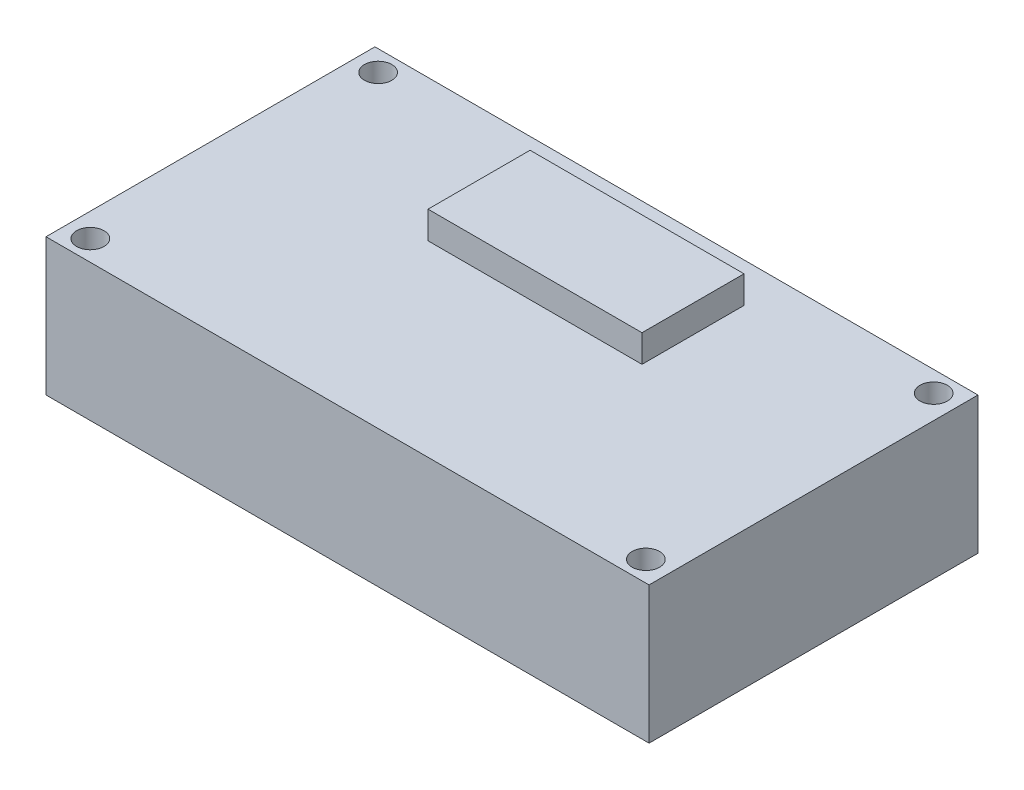
ISO-10303-21;
HEADER;
FILE_DESCRIPTION(('STEP AP214'),'2;1');
FILE_NAME('part.step','',(''),(''),'','','');
FILE_SCHEMA(('AUTOMOTIVE_DESIGN { 1 0 10303 214 1 1 1 1 }'));
ENDSEC;
DATA;
#1=APPLICATION_CONTEXT('core data for automotive mechanical design processes');
#2=APPLICATION_PROTOCOL_DEFINITION('international standard','automotive_design',2000,#1);
#3=PRODUCT_CONTEXT('',#1,'mechanical');
#4=PRODUCT('Part','Part','',(#3));
#5=PRODUCT_RELATED_PRODUCT_CATEGORY('part','',(#4));
#6=PRODUCT_DEFINITION_FORMATION('','',#4);
#7=PRODUCT_DEFINITION_CONTEXT('part definition',#1,'design');
#8=PRODUCT_DEFINITION('design','',#6,#7);
#9=PRODUCT_DEFINITION_SHAPE('','',#8);
#10=(LENGTH_UNIT() NAMED_UNIT(*) SI_UNIT(.MILLI.,.METRE.));
#11=(NAMED_UNIT(*) PLANE_ANGLE_UNIT() SI_UNIT($,.RADIAN.));
#12=(NAMED_UNIT(*) SI_UNIT($,.STERADIAN.) SOLID_ANGLE_UNIT());
#13=UNCERTAINTY_MEASURE_WITH_UNIT(LENGTH_MEASURE(1.E-05),#10,'distance_accuracy_value','');
#14=(GEOMETRIC_REPRESENTATION_CONTEXT(3) GLOBAL_UNCERTAINTY_ASSIGNED_CONTEXT((#13)) GLOBAL_UNIT_ASSIGNED_CONTEXT((#10,
#11,#12)) REPRESENTATION_CONTEXT('',''));
#15=CARTESIAN_POINT('',(0.,0.,0.));
#16=DIRECTION('',(0.,0.,1.));
#17=DIRECTION('',(1.,0.,0.));
#18=AXIS2_PLACEMENT_3D('',#15,#16,#17);
#19=CARTESIAN_POINT('',(0.,15.,0.));
#20=DIRECTION('',(0.,-1.,0.));
#21=DIRECTION('',(0.,0.,-1.));
#22=AXIS2_PLACEMENT_3D('',#19,#20,#21);
#23=PLANE('',#22);
#24=DIRECTION('',(0.,0.,-1.));
#25=VECTOR('',#24,1.);
#26=CARTESIAN_POINT('',(33.,15.,18.));
#27=LINE('',#26,#25);
#28=CARTESIAN_POINT('',(33.,15.,18.));
#29=VERTEX_POINT('',#28);
#30=CARTESIAN_POINT('',(33.,15.,-18.));
#31=VERTEX_POINT('',#30);
#32=EDGE_CURVE('E174',#29,#31,#27,.T.);
#33=ORIENTED_EDGE('',*,*,#32,.T.);
#34=DIRECTION('',(-1.,0.,0.));
#35=VECTOR('',#34,1.);
#36=CARTESIAN_POINT('',(-33.,15.,-18.));
#37=LINE('',#36,#35);
#38=CARTESIAN_POINT('',(-33.,15.,-18.));
#39=VERTEX_POINT('',#38);
#40=EDGE_CURVE('E178',#31,#39,#37,.T.);
#41=ORIENTED_EDGE('',*,*,#40,.T.);
#42=DIRECTION('',(0.,0.,1.));
#43=VECTOR('',#42,1.);
#44=CARTESIAN_POINT('',(-33.,15.,18.));
#45=LINE('',#44,#43);
#46=CARTESIAN_POINT('',(-33.,15.,18.));
#47=VERTEX_POINT('',#46);
#48=EDGE_CURVE('E182',#39,#47,#45,.T.);
#49=ORIENTED_EDGE('',*,*,#48,.T.);
#50=DIRECTION('',(1.,0.,0.));
#51=VECTOR('',#50,1.);
#52=CARTESIAN_POINT('',(-33.,15.,18.));
#53=LINE('',#52,#51);
#54=EDGE_CURVE('E185',#47,#29,#53,.T.);
#55=ORIENTED_EDGE('',*,*,#54,.T.);
#56=EDGE_LOOP('',(#33,#41,#49,#55));
#57=FACE_BOUND('',#56,.T.);
#58=CARTESIAN_POINT('',(-30.4,15.,-15.75));
#59=DIRECTION('',(0.,1.,0.));
#60=DIRECTION('',(0.,0.,1.));
#61=AXIS2_PLACEMENT_3D('',#58,#59,#60);
#62=CIRCLE('',#61,1.5);
#63=CARTESIAN_POINT('',(-30.4,15.,-14.25));
#64=VERTEX_POINT('',#63);
#65=EDGE_CURVE('E150',#64,#64,#62,.T.);
#66=ORIENTED_EDGE('',*,*,#65,.F.);
#67=EDGE_LOOP('',(#66));
#68=FACE_BOUND('',#67,.T.);
#69=CARTESIAN_POINT('',(-30.4,15.,15.75));
#70=DIRECTION('',(0.,1.,0.));
#71=DIRECTION('',(0.,0.,1.));
#72=AXIS2_PLACEMENT_3D('',#69,#70,#71);
#73=CIRCLE('',#72,1.5);
#74=CARTESIAN_POINT('',(-30.4,15.,17.25));
#75=VERTEX_POINT('',#74);
#76=EDGE_CURVE('E146',#75,#75,#73,.T.);
#77=ORIENTED_EDGE('',*,*,#76,.F.);
#78=EDGE_LOOP('',(#77));
#79=FACE_BOUND('',#78,.T.);
#80=CARTESIAN_POINT('',(30.4,15.,15.75));
#81=DIRECTION('',(0.,1.,0.));
#82=DIRECTION('',(0.,0.,1.));
#83=AXIS2_PLACEMENT_3D('',#80,#81,#82);
#84=CIRCLE('',#83,1.5);
#85=CARTESIAN_POINT('',(30.4,15.,17.25));
#86=VERTEX_POINT('',#85);
#87=EDGE_CURVE('E155',#86,#86,#84,.T.);
#88=ORIENTED_EDGE('',*,*,#87,.F.);
#89=EDGE_LOOP('',(#88));
#90=FACE_BOUND('',#89,.T.);
#91=CARTESIAN_POINT('',(30.4,15.,-15.75));
#92=DIRECTION('',(0.,1.,0.));
#93=DIRECTION('',(0.,0.,1.));
#94=AXIS2_PLACEMENT_3D('',#91,#92,#93);
#95=CIRCLE('',#94,1.5);
#96=CARTESIAN_POINT('',(30.4,15.,-14.25));
#97=VERTEX_POINT('',#96);
#98=EDGE_CURVE('E140',#97,#97,#95,.T.);
#99=ORIENTED_EDGE('',*,*,#98,.F.);
#100=EDGE_LOOP('',(#99));
#101=FACE_BOUND('',#100,.T.);
#102=DIRECTION('',(0.,0.,-1.));
#103=VECTOR('',#102,1.);
#104=CARTESIAN_POINT('',(11.7084577626007,15.,-2.51907254797765));
#105=LINE('',#104,#103);
#106=CARTESIAN_POINT('',(11.7084577626007,15.,-2.51907254797765));
#107=VERTEX_POINT('',#106);
#108=CARTESIAN_POINT('',(11.7084577626007,15.,-13.6858578873975));
#109=VERTEX_POINT('',#108);
#110=EDGE_CURVE('E133',#107,#109,#105,.T.);
#111=ORIENTED_EDGE('',*,*,#110,.F.);
#112=DIRECTION('',(1.,0.,0.));
#113=VECTOR('',#112,1.);
#114=CARTESIAN_POINT('',(-11.7084577626007,15.,-2.51907254797765));
#115=LINE('',#114,#113);
#116=CARTESIAN_POINT('',(-11.7084577626007,15.,-2.51907254797765));
#117=VERTEX_POINT('',#116);
#118=EDGE_CURVE('E130',#117,#107,#115,.T.);
#119=ORIENTED_EDGE('',*,*,#118,.F.);
#120=DIRECTION('',(0.,0.,1.));
#121=VECTOR('',#120,1.);
#122=CARTESIAN_POINT('',(-11.7084577626007,15.,-2.51907254797765));
#123=LINE('',#122,#121);
#124=CARTESIAN_POINT('',(-11.7084577626007,15.,-13.6858578873975));
#125=VERTEX_POINT('',#124);
#126=EDGE_CURVE('E66',#125,#117,#123,.T.);
#127=ORIENTED_EDGE('',*,*,#126,.F.);
#128=DIRECTION('',(-1.,0.,0.));
#129=VECTOR('',#128,1.);
#130=CARTESIAN_POINT('',(-11.7084577626007,15.,-13.6858578873975));
#131=LINE('',#130,#129);
#132=EDGE_CURVE('E61',#109,#125,#131,.T.);
#133=ORIENTED_EDGE('',*,*,#132,.F.);
#134=EDGE_LOOP('',(#111,#119,#127,#133));
#135=FACE_BOUND('',#134,.T.);
#136=ADVANCED_FACE('F45',(#57,#68,#79,#90,#101,#135),#23,.F.);
#137=CARTESIAN_POINT('',(33.,15.,18.));
#138=DIRECTION('',(-1.,0.,0.));
#139=DIRECTION('',(0.,0.,1.));
#140=AXIS2_PLACEMENT_3D('',#137,#138,#139);
#141=PLANE('',#140);
#142=DIRECTION('',(0.,0.,-1.));
#143=VECTOR('',#142,1.);
#144=CARTESIAN_POINT('',(33.,0.,18.));
#145=LINE('',#144,#143);
#146=CARTESIAN_POINT('',(33.,0.,18.));
#147=VERTEX_POINT('',#146);
#148=CARTESIAN_POINT('',(33.,0.,-18.));
#149=VERTEX_POINT('',#148);
#150=EDGE_CURVE('E170',#147,#149,#145,.T.);
#151=ORIENTED_EDGE('',*,*,#150,.T.);
#152=DIRECTION('',(0.,-1.,0.));
#153=VECTOR('',#152,1.);
#154=CARTESIAN_POINT('',(33.,15.,-18.));
#155=LINE('',#154,#153);
#156=EDGE_CURVE('E11',#31,#149,#155,.T.);
#157=ORIENTED_EDGE('',*,*,#156,.F.);
#158=ORIENTED_EDGE('',*,*,#32,.F.);
#159=DIRECTION('',(0.,-1.,0.));
#160=VECTOR('',#159,1.);
#161=CARTESIAN_POINT('',(33.,15.,18.));
#162=LINE('',#161,#160);
#163=EDGE_CURVE('E188',#29,#147,#162,.T.);
#164=ORIENTED_EDGE('',*,*,#163,.T.);
#165=EDGE_LOOP('',(#151,#157,#158,#164));
#166=FACE_BOUND('',#165,.T.);
#167=ADVANCED_FACE('F47',(#166),#141,.F.);
#168=CARTESIAN_POINT('',(-33.,15.,-18.));
#169=DIRECTION('',(0.,0.,1.));
#170=DIRECTION('',(1.,0.,0.));
#171=AXIS2_PLACEMENT_3D('',#168,#169,#170);
#172=PLANE('',#171);
#173=DIRECTION('',(-1.,0.,0.));
#174=VECTOR('',#173,1.);
#175=CARTESIAN_POINT('',(-33.,0.,-18.));
#176=LINE('',#175,#174);
#177=CARTESIAN_POINT('',(-33.,0.,-18.));
#178=VERTEX_POINT('',#177);
#179=EDGE_CURVE('E192',#149,#178,#176,.T.);
#180=ORIENTED_EDGE('',*,*,#179,.T.);
#181=DIRECTION('',(0.,-1.,0.));
#182=VECTOR('',#181,1.);
#183=CARTESIAN_POINT('',(-33.,15.,-18.));
#184=LINE('',#183,#182);
#185=EDGE_CURVE('E54',#39,#178,#184,.T.);
#186=ORIENTED_EDGE('',*,*,#185,.F.);
#187=ORIENTED_EDGE('',*,*,#40,.F.);
#188=ORIENTED_EDGE('',*,*,#156,.T.);
#189=EDGE_LOOP('',(#180,#186,#187,#188));
#190=FACE_BOUND('',#189,.T.);
#191=ADVANCED_FACE('F228',(#190),#172,.F.);
#192=CARTESIAN_POINT('',(-33.,15.,18.));
#193=DIRECTION('',(1.,0.,0.));
#194=DIRECTION('',(0.,0.,-1.));
#195=AXIS2_PLACEMENT_3D('',#192,#193,#194);
#196=PLANE('',#195);
#197=DIRECTION('',(0.,0.,1.));
#198=VECTOR('',#197,1.);
#199=CARTESIAN_POINT('',(-33.,0.,18.));
#200=LINE('',#199,#198);
#201=CARTESIAN_POINT('',(-33.,0.,18.));
#202=VERTEX_POINT('',#201);
#203=EDGE_CURVE('E195',#178,#202,#200,.T.);
#204=ORIENTED_EDGE('',*,*,#203,.T.);
#205=DIRECTION('',(0.,-1.,0.));
#206=VECTOR('',#205,1.);
#207=CARTESIAN_POINT('',(-33.,15.,18.));
#208=LINE('',#207,#206);
#209=EDGE_CURVE('E203',#47,#202,#208,.T.);
#210=ORIENTED_EDGE('',*,*,#209,.F.);
#211=ORIENTED_EDGE('',*,*,#48,.F.);
#212=ORIENTED_EDGE('',*,*,#185,.T.);
#213=EDGE_LOOP('',(#204,#210,#211,#212));
#214=FACE_BOUND('',#213,.T.);
#215=ADVANCED_FACE('F212',(#214),#196,.F.);
#216=CARTESIAN_POINT('',(-33.,15.,18.));
#217=DIRECTION('',(0.,0.,-1.));
#218=DIRECTION('',(-1.,0.,0.));
#219=AXIS2_PLACEMENT_3D('',#216,#217,#218);
#220=PLANE('',#219);
#221=DIRECTION('',(1.,0.,0.));
#222=VECTOR('',#221,1.);
#223=CARTESIAN_POINT('',(-33.,0.,18.));
#224=LINE('',#223,#222);
#225=EDGE_CURVE('E179',#202,#147,#224,.T.);
#226=ORIENTED_EDGE('',*,*,#225,.T.);
#227=ORIENTED_EDGE('',*,*,#163,.F.);
#228=ORIENTED_EDGE('',*,*,#54,.F.);
#229=ORIENTED_EDGE('',*,*,#209,.T.);
#230=EDGE_LOOP('',(#226,#227,#228,#229));
#231=FACE_BOUND('',#230,.T.);
#232=ADVANCED_FACE('F221',(#231),#220,.F.);
#233=CARTESIAN_POINT('',(0.,0.,0.));
#234=DIRECTION('',(0.,-1.,0.));
#235=DIRECTION('',(0.,0.,-1.));
#236=AXIS2_PLACEMENT_3D('',#233,#234,#235);
#237=PLANE('',#236);
#238=CARTESIAN_POINT('',(30.4,0.,-15.75));
#239=DIRECTION('',(0.,1.,0.));
#240=DIRECTION('',(0.,0.,1.));
#241=AXIS2_PLACEMENT_3D('',#238,#239,#240);
#242=CIRCLE('',#241,1.5);
#243=CARTESIAN_POINT('',(30.4,0.,-14.25));
#244=VERTEX_POINT('',#243);
#245=EDGE_CURVE('E135',#244,#244,#242,.T.);
#246=ORIENTED_EDGE('',*,*,#245,.T.);
#247=EDGE_LOOP('',(#246));
#248=FACE_BOUND('',#247,.T.);
#249=CARTESIAN_POINT('',(30.4,0.,15.75));
#250=DIRECTION('',(0.,1.,0.));
#251=DIRECTION('',(0.,0.,1.));
#252=AXIS2_PLACEMENT_3D('',#249,#250,#251);
#253=CIRCLE('',#252,1.5);
#254=CARTESIAN_POINT('',(30.4,0.,17.25));
#255=VERTEX_POINT('',#254);
#256=EDGE_CURVE('E159',#255,#255,#253,.T.);
#257=ORIENTED_EDGE('',*,*,#256,.T.);
#258=EDGE_LOOP('',(#257));
#259=FACE_BOUND('',#258,.T.);
#260=CARTESIAN_POINT('',(-30.4,0.,15.75));
#261=DIRECTION('',(0.,1.,0.));
#262=DIRECTION('',(0.,0.,1.));
#263=AXIS2_PLACEMENT_3D('',#260,#261,#262);
#264=CIRCLE('',#263,1.5);
#265=CARTESIAN_POINT('',(-30.4,0.,17.25));
#266=VERTEX_POINT('',#265);
#267=EDGE_CURVE('E151',#266,#266,#264,.T.);
#268=ORIENTED_EDGE('',*,*,#267,.T.);
#269=EDGE_LOOP('',(#268));
#270=FACE_BOUND('',#269,.T.);
#271=CARTESIAN_POINT('',(-30.4,0.,-15.75));
#272=DIRECTION('',(0.,1.,0.));
#273=DIRECTION('',(0.,0.,1.));
#274=AXIS2_PLACEMENT_3D('',#271,#272,#273);
#275=CIRCLE('',#274,1.5);
#276=CARTESIAN_POINT('',(-30.4,0.,-14.25));
#277=VERTEX_POINT('',#276);
#278=EDGE_CURVE('E166',#277,#277,#275,.T.);
#279=ORIENTED_EDGE('',*,*,#278,.T.);
#280=EDGE_LOOP('',(#279));
#281=FACE_BOUND('',#280,.T.);
#282=ORIENTED_EDGE('',*,*,#150,.F.);
#283=ORIENTED_EDGE('',*,*,#225,.F.);
#284=ORIENTED_EDGE('',*,*,#203,.F.);
#285=ORIENTED_EDGE('',*,*,#179,.F.);
#286=EDGE_LOOP('',(#282,#283,#284,#285));
#287=FACE_BOUND('',#286,.T.);
#288=ADVANCED_FACE('F218',(#248,#259,#270,#281,#287),#237,.T.);
#289=CARTESIAN_POINT('',(-30.4,0.,-15.75));
#290=DIRECTION('',(0.,1.,0.));
#291=DIRECTION('',(0.,0.,1.));
#292=AXIS2_PLACEMENT_3D('',#289,#290,#291);
#293=CYLINDRICAL_SURFACE('',#292,1.5);
#294=ORIENTED_EDGE('',*,*,#278,.F.);
#295=EDGE_LOOP('',(#294));
#296=FACE_BOUND('',#295,.T.);
#297=ORIENTED_EDGE('',*,*,#65,.T.);
#298=EDGE_LOOP('',(#297));
#299=FACE_BOUND('',#298,.T.);
#300=ADVANCED_FACE('F243',(#296,#299),#293,.F.);
#301=CARTESIAN_POINT('',(-30.4,0.,15.75));
#302=DIRECTION('',(0.,1.,0.));
#303=DIRECTION('',(0.,0.,1.));
#304=AXIS2_PLACEMENT_3D('',#301,#302,#303);
#305=CYLINDRICAL_SURFACE('',#304,1.5);
#306=ORIENTED_EDGE('',*,*,#267,.F.);
#307=EDGE_LOOP('',(#306));
#308=FACE_BOUND('',#307,.T.);
#309=ORIENTED_EDGE('',*,*,#76,.T.);
#310=EDGE_LOOP('',(#309));
#311=FACE_BOUND('',#310,.T.);
#312=ADVANCED_FACE('F265',(#308,#311),#305,.F.);
#313=CARTESIAN_POINT('',(30.4,0.,15.75));
#314=DIRECTION('',(0.,1.,0.));
#315=DIRECTION('',(0.,0.,1.));
#316=AXIS2_PLACEMENT_3D('',#313,#314,#315);
#317=CYLINDRICAL_SURFACE('',#316,1.5);
#318=ORIENTED_EDGE('',*,*,#256,.F.);
#319=EDGE_LOOP('',(#318));
#320=FACE_BOUND('',#319,.T.);
#321=ORIENTED_EDGE('',*,*,#87,.T.);
#322=EDGE_LOOP('',(#321));
#323=FACE_BOUND('',#322,.T.);
#324=ADVANCED_FACE('F273',(#320,#323),#317,.F.);
#325=CARTESIAN_POINT('',(30.4,0.,-15.75));
#326=DIRECTION('',(0.,1.,0.));
#327=DIRECTION('',(0.,0.,1.));
#328=AXIS2_PLACEMENT_3D('',#325,#326,#327);
#329=CYLINDRICAL_SURFACE('',#328,1.5);
#330=ORIENTED_EDGE('',*,*,#245,.F.);
#331=EDGE_LOOP('',(#330));
#332=FACE_BOUND('',#331,.T.);
#333=ORIENTED_EDGE('',*,*,#98,.T.);
#334=EDGE_LOOP('',(#333));
#335=FACE_BOUND('',#334,.T.);
#336=ADVANCED_FACE('F281',(#332,#335),#329,.F.);
#337=CARTESIAN_POINT('',(11.7084577626007,18.,-2.51907254797765));
#338=DIRECTION('',(-1.,0.,0.));
#339=DIRECTION('',(0.,0.,1.));
#340=AXIS2_PLACEMENT_3D('',#337,#338,#339);
#341=PLANE('',#340);
#342=ORIENTED_EDGE('',*,*,#110,.T.);
#343=DIRECTION('',(0.,-1.,0.));
#344=VECTOR('',#343,1.);
#345=CARTESIAN_POINT('',(11.7084577626007,18.,-13.6858578873975));
#346=LINE('',#345,#344);
#347=CARTESIAN_POINT('',(11.7084577626007,18.,-13.6858578873975));
#348=VERTEX_POINT('',#347);
#349=EDGE_CURVE('E112',#348,#109,#346,.T.);
#350=ORIENTED_EDGE('',*,*,#349,.F.);
#351=DIRECTION('',(0.,0.,-1.));
#352=VECTOR('',#351,1.);
#353=CARTESIAN_POINT('',(11.7084577626007,18.,-2.51907254797765));
#354=LINE('',#353,#352);
#355=CARTESIAN_POINT('',(11.7084577626007,18.,-2.51907254797765));
#356=VERTEX_POINT('',#355);
#357=EDGE_CURVE('E120',#356,#348,#354,.T.);
#358=ORIENTED_EDGE('',*,*,#357,.F.);
#359=DIRECTION('',(0.,-1.,0.));
#360=VECTOR('',#359,1.);
#361=CARTESIAN_POINT('',(11.7084577626007,18.,-2.51907254797765));
#362=LINE('',#361,#360);
#363=EDGE_CURVE('E343',#356,#107,#362,.T.);
#364=ORIENTED_EDGE('',*,*,#363,.T.);
#365=EDGE_LOOP('',(#342,#350,#358,#364));
#366=FACE_BOUND('',#365,.T.);
#367=ADVANCED_FACE('F132',(#366),#341,.F.);
#368=CARTESIAN_POINT('',(-11.7084577626007,18.,-13.6858578873975));
#369=DIRECTION('',(0.,0.,1.));
#370=DIRECTION('',(1.,0.,0.));
#371=AXIS2_PLACEMENT_3D('',#368,#369,#370);
#372=PLANE('',#371);
#373=ORIENTED_EDGE('',*,*,#132,.T.);
#374=DIRECTION('',(0.,-1.,0.));
#375=VECTOR('',#374,1.);
#376=CARTESIAN_POINT('',(-11.7084577626007,18.,-13.6858578873975));
#377=LINE('',#376,#375);
#378=CARTESIAN_POINT('',(-11.7084577626007,18.,-13.6858578873975));
#379=VERTEX_POINT('',#378);
#380=EDGE_CURVE('E115',#379,#125,#377,.T.);
#381=ORIENTED_EDGE('',*,*,#380,.F.);
#382=DIRECTION('',(-1.,0.,0.));
#383=VECTOR('',#382,1.);
#384=CARTESIAN_POINT('',(-11.7084577626007,18.,-13.6858578873975));
#385=LINE('',#384,#383);
#386=EDGE_CURVE('E108',#348,#379,#385,.T.);
#387=ORIENTED_EDGE('',*,*,#386,.F.);
#388=ORIENTED_EDGE('',*,*,#349,.T.);
#389=EDGE_LOOP('',(#373,#381,#387,#388));
#390=FACE_BOUND('',#389,.T.);
#391=ADVANCED_FACE('F110',(#390),#372,.F.);
#392=CARTESIAN_POINT('',(-11.7084577626007,18.,-2.51907254797765));
#393=DIRECTION('',(1.,0.,0.));
#394=DIRECTION('',(0.,0.,-1.));
#395=AXIS2_PLACEMENT_3D('',#392,#393,#394);
#396=PLANE('',#395);
#397=ORIENTED_EDGE('',*,*,#126,.T.);
#398=DIRECTION('',(0.,-1.,0.));
#399=VECTOR('',#398,1.);
#400=CARTESIAN_POINT('',(-11.7084577626007,18.,-2.51907254797765));
#401=LINE('',#400,#399);
#402=CARTESIAN_POINT('',(-11.7084577626007,18.,-2.51907254797765));
#403=VERTEX_POINT('',#402);
#404=EDGE_CURVE('E142',#403,#117,#401,.T.);
#405=ORIENTED_EDGE('',*,*,#404,.F.);
#406=DIRECTION('',(0.,0.,1.));
#407=VECTOR('',#406,1.);
#408=CARTESIAN_POINT('',(-11.7084577626007,18.,-2.51907254797765));
#409=LINE('',#408,#407);
#410=EDGE_CURVE('E119',#379,#403,#409,.T.);
#411=ORIENTED_EDGE('',*,*,#410,.F.);
#412=ORIENTED_EDGE('',*,*,#380,.T.);
#413=EDGE_LOOP('',(#397,#405,#411,#412));
#414=FACE_BOUND('',#413,.T.);
#415=ADVANCED_FACE('F311',(#414),#396,.F.);
#416=CARTESIAN_POINT('',(-11.7084577626007,18.,-2.51907254797765));
#417=DIRECTION('',(0.,0.,-1.));
#418=DIRECTION('',(-1.,0.,0.));
#419=AXIS2_PLACEMENT_3D('',#416,#417,#418);
#420=PLANE('',#419);
#421=ORIENTED_EDGE('',*,*,#118,.T.);
#422=ORIENTED_EDGE('',*,*,#363,.F.);
#423=DIRECTION('',(1.,0.,0.));
#424=VECTOR('',#423,1.);
#425=CARTESIAN_POINT('',(-11.7084577626007,18.,-2.51907254797765));
#426=LINE('',#425,#424);
#427=EDGE_CURVE('E125',#403,#356,#426,.T.);
#428=ORIENTED_EDGE('',*,*,#427,.F.);
#429=ORIENTED_EDGE('',*,*,#404,.T.);
#430=EDGE_LOOP('',(#421,#422,#428,#429));
#431=FACE_BOUND('',#430,.T.);
#432=ADVANCED_FACE('F320',(#431),#420,.F.);
#433=CARTESIAN_POINT('',(0.,18.,0.));
#434=DIRECTION('',(0.,-1.,0.));
#435=DIRECTION('',(0.,0.,-1.));
#436=AXIS2_PLACEMENT_3D('',#433,#434,#435);
#437=PLANE('',#436);
#438=ORIENTED_EDGE('',*,*,#357,.T.);
#439=ORIENTED_EDGE('',*,*,#386,.T.);
#440=ORIENTED_EDGE('',*,*,#410,.T.);
#441=ORIENTED_EDGE('',*,*,#427,.T.);
#442=EDGE_LOOP('',(#438,#439,#440,#441));
#443=FACE_BOUND('',#442,.T.);
#444=ADVANCED_FACE('F123',(#443),#437,.F.);
#445=CLOSED_SHELL('',(#136,#167,#191,#215,#232,#288,#300,#312,#324,#336,#367,#391,#415,#432,#444));
#446=MANIFOLD_SOLID_BREP('B2',#445);
#447=ADVANCED_BREP_SHAPE_REPRESENTATION('',(#18,#446),#14);
#448=SHAPE_DEFINITION_REPRESENTATION(#9,#447);
ENDSEC;
END-ISO-10303-21;
